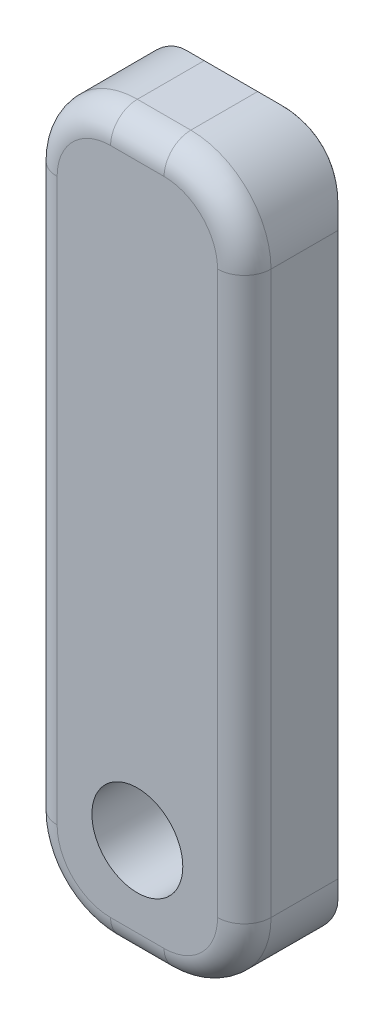
ISO-10303-21;
HEADER;
FILE_DESCRIPTION(('STEP AP214'),'2;1');
FILE_NAME('part.step','',(''),(''),'','','');
FILE_SCHEMA(('AUTOMOTIVE_DESIGN { 1 0 10303 214 1 1 1 1 }'));
ENDSEC;
DATA;
#1=APPLICATION_CONTEXT('core data for automotive mechanical design processes');
#2=APPLICATION_PROTOCOL_DEFINITION('international standard','automotive_design',2000,#1);
#3=PRODUCT_CONTEXT('',#1,'mechanical');
#4=PRODUCT('Part','Part','',(#3));
#5=PRODUCT_RELATED_PRODUCT_CATEGORY('part','',(#4));
#6=PRODUCT_DEFINITION_FORMATION('','',#4);
#7=PRODUCT_DEFINITION_CONTEXT('part definition',#1,'design');
#8=PRODUCT_DEFINITION('design','',#6,#7);
#9=PRODUCT_DEFINITION_SHAPE('','',#8);
#10=(LENGTH_UNIT() NAMED_UNIT(*) SI_UNIT(.MILLI.,.METRE.));
#11=(NAMED_UNIT(*) PLANE_ANGLE_UNIT() SI_UNIT($,.RADIAN.));
#12=(NAMED_UNIT(*) SI_UNIT($,.STERADIAN.) SOLID_ANGLE_UNIT());
#13=UNCERTAINTY_MEASURE_WITH_UNIT(LENGTH_MEASURE(1.E-05),#10,'distance_accuracy_value','');
#14=(GEOMETRIC_REPRESENTATION_CONTEXT(3) GLOBAL_UNCERTAINTY_ASSIGNED_CONTEXT((#13)) GLOBAL_UNIT_ASSIGNED_CONTEXT((#10,
#11,#12)) REPRESENTATION_CONTEXT('',''));
#15=CARTESIAN_POINT('',(0.,0.,0.));
#16=DIRECTION('',(0.,0.,1.));
#17=DIRECTION('',(1.,0.,0.));
#18=AXIS2_PLACEMENT_3D('',#15,#16,#17);
#19=CARTESIAN_POINT('',(0.,0.,5.));
#20=DIRECTION('',(0.,0.,1.));
#21=DIRECTION('',(1.,0.,0.));
#22=AXIS2_PLACEMENT_3D('',#19,#20,#21);
#23=PLANE('',#22);
#24=CARTESIAN_POINT('',(0.,-9.49999999999999,5.));
#25=DIRECTION('',(0.,0.,1.));
#26=DIRECTION('',(1.,0.,0.));
#27=AXIS2_PLACEMENT_3D('',#24,#25,#26);
#28=CIRCLE('',#27,1.7);
#29=CARTESIAN_POINT('',(1.7,-9.49999999999999,5.));
#30=VERTEX_POINT('',#29);
#31=EDGE_CURVE('E479',#30,#30,#28,.T.);
#32=ORIENTED_EDGE('',*,*,#31,.F.);
#33=EDGE_LOOP('',(#32));
#34=FACE_BOUND('',#33,.T.);
#35=CARTESIAN_POINT('',(-0.999999999999996,10.5,5.));
#36=DIRECTION('',(0.,0.,1.));
#37=DIRECTION('',(1.,0.,0.));
#38=AXIS2_PLACEMENT_3D('',#35,#36,#37);
#39=CIRCLE('',#38,2.);
#40=CARTESIAN_POINT('',(-3.,10.5,5.));
#41=VERTEX_POINT('',#40);
#42=CARTESIAN_POINT('',(-0.999999999999996,12.5,5.));
#43=VERTEX_POINT('',#42);
#44=EDGE_CURVE('E207',#41,#43,#39,.F.);
#45=ORIENTED_EDGE('',*,*,#44,.F.);
#46=DIRECTION('',(0.,-1.,0.));
#47=VECTOR('',#46,1.);
#48=CARTESIAN_POINT('',(-3.,-13.5,5.));
#49=LINE('',#48,#47);
#50=CARTESIAN_POINT('',(-3.,-10.5,5.));
#51=VERTEX_POINT('',#50);
#52=EDGE_CURVE('E337',#41,#51,#49,.T.);
#53=ORIENTED_EDGE('',*,*,#52,.T.);
#54=CARTESIAN_POINT('',(-0.999999999999999,-10.5,5.));
#55=DIRECTION('',(0.,0.,1.));
#56=DIRECTION('',(1.,0.,0.));
#57=AXIS2_PLACEMENT_3D('',#54,#55,#56);
#58=CIRCLE('',#57,2.);
#59=CARTESIAN_POINT('',(-0.999999999999998,-12.5,5.));
#60=VERTEX_POINT('',#59);
#61=EDGE_CURVE('E217',#60,#51,#58,.F.);
#62=ORIENTED_EDGE('',*,*,#61,.F.);
#63=DIRECTION('',(1.,0.,0.));
#64=VECTOR('',#63,1.);
#65=CARTESIAN_POINT('',(4.,-12.5,5.));
#66=LINE('',#65,#64);
#67=CARTESIAN_POINT('',(1.,-12.5,5.));
#68=VERTEX_POINT('',#67);
#69=EDGE_CURVE('E343',#60,#68,#66,.T.);
#70=ORIENTED_EDGE('',*,*,#69,.T.);
#71=CARTESIAN_POINT('',(1.,-10.5,5.));
#72=DIRECTION('',(0.,0.,1.));
#73=DIRECTION('',(1.,0.,0.));
#74=AXIS2_PLACEMENT_3D('',#71,#72,#73);
#75=CIRCLE('',#74,2.);
#76=CARTESIAN_POINT('',(3.,-10.5,5.));
#77=VERTEX_POINT('',#76);
#78=EDGE_CURVE('E211',#77,#68,#75,.F.);
#79=ORIENTED_EDGE('',*,*,#78,.F.);
#80=DIRECTION('',(0.,1.,0.));
#81=VECTOR('',#80,1.);
#82=CARTESIAN_POINT('',(3.,13.5,5.));
#83=LINE('',#82,#81);
#84=CARTESIAN_POINT('',(3.,10.5,5.));
#85=VERTEX_POINT('',#84);
#86=EDGE_CURVE('E340',#77,#85,#83,.T.);
#87=ORIENTED_EDGE('',*,*,#86,.T.);
#88=CARTESIAN_POINT('',(0.999999999999999,10.5,5.));
#89=DIRECTION('',(0.,0.,1.));
#90=DIRECTION('',(1.,0.,0.));
#91=AXIS2_PLACEMENT_3D('',#88,#89,#90);
#92=CIRCLE('',#91,2.);
#93=CARTESIAN_POINT('',(0.999999999999999,12.5,5.));
#94=VERTEX_POINT('',#93);
#95=EDGE_CURVE('E208',#94,#85,#92,.F.);
#96=ORIENTED_EDGE('',*,*,#95,.F.);
#97=DIRECTION('',(-1.,0.,0.));
#98=VECTOR('',#97,1.);
#99=CARTESIAN_POINT('',(-4.,12.5,5.));
#100=LINE('',#99,#98);
#101=EDGE_CURVE('E335',#94,#43,#100,.T.);
#102=ORIENTED_EDGE('',*,*,#101,.T.);
#103=EDGE_LOOP('',(#45,#53,#62,#70,#79,#87,#96,#102));
#104=FACE_BOUND('',#103,.T.);
#105=ADVANCED_FACE('F34',(#34,#104),#23,.T.);
#106=CARTESIAN_POINT('',(0.,0.,0.));
#107=DIRECTION('',(0.,0.,1.));
#108=DIRECTION('',(1.,0.,0.));
#109=AXIS2_PLACEMENT_3D('',#106,#107,#108);
#110=PLANE('',#109);
#111=DIRECTION('',(0.,-1.,0.));
#112=VECTOR('',#111,1.);
#113=CARTESIAN_POINT('',(2.49999999999999,0.,0.));
#114=LINE('',#113,#112);
#115=CARTESIAN_POINT('',(2.49999999999999,9.87867965644034,0.));
#116=VERTEX_POINT('',#115);
#117=CARTESIAN_POINT('',(2.49999999999999,-9.87867965644035,0.));
#118=VERTEX_POINT('',#117);
#119=EDGE_CURVE('E318',#116,#118,#114,.T.);
#120=ORIENTED_EDGE('',*,*,#119,.T.);
#121=CARTESIAN_POINT('',(-1.74264068711931,-7.75735931288069,0.));
#122=DIRECTION('',(0.,0.,1.));
#123=DIRECTION('',(0.707106781186548,-0.707106781186547,0.));
#124=AXIS2_PLACEMENT_3D('',#121,#122,#123);
#125=ELLIPSE('',#124,5.19615242270665,3.);
#126=CARTESIAN_POINT('',(0.37867965644035,-12.,0.));
#127=VERTEX_POINT('',#126);
#128=EDGE_CURVE('E255',#118,#127,#125,.F.);
#129=ORIENTED_EDGE('',*,*,#128,.T.);
#130=DIRECTION('',(-1.,0.,0.));
#131=VECTOR('',#130,1.);
#132=CARTESIAN_POINT('',(0.,-12.,0.));
#133=LINE('',#132,#131);
#134=CARTESIAN_POINT('',(-0.378679656440348,-12.,0.));
#135=VERTEX_POINT('',#134);
#136=EDGE_CURVE('E320',#127,#135,#133,.T.);
#137=ORIENTED_EDGE('',*,*,#136,.T.);
#138=CARTESIAN_POINT('',(1.74264068711931,-7.75735931288069,0.));
#139=DIRECTION('',(0.,0.,1.));
#140=DIRECTION('',(0.707106781186548,0.707106781186547,0.));
#141=AXIS2_PLACEMENT_3D('',#138,#139,#140);
#142=ELLIPSE('',#141,5.19615242270665,3.);
#143=CARTESIAN_POINT('',(-2.49999999999999,-9.87867965644034,0.));
#144=VERTEX_POINT('',#143);
#145=EDGE_CURVE('E253',#135,#144,#142,.F.);
#146=ORIENTED_EDGE('',*,*,#145,.T.);
#147=DIRECTION('',(0.,1.,0.));
#148=VECTOR('',#147,1.);
#149=CARTESIAN_POINT('',(-2.49999999999999,0.,0.));
#150=LINE('',#149,#148);
#151=CARTESIAN_POINT('',(-2.49999999999998,9.87867965644034,0.));
#152=VERTEX_POINT('',#151);
#153=EDGE_CURVE('E317',#144,#152,#150,.T.);
#154=ORIENTED_EDGE('',*,*,#153,.T.);
#155=CARTESIAN_POINT('',(1.74264068711931,7.75735931288068,0.));
#156=DIRECTION('',(0.,0.,1.));
#157=DIRECTION('',(0.707106781186547,-0.707106781186548,0.));
#158=AXIS2_PLACEMENT_3D('',#155,#156,#157);
#159=ELLIPSE('',#158,5.19615242270665,3.);
#160=CARTESIAN_POINT('',(-0.378679656440345,12.,0.));
#161=VERTEX_POINT('',#160);
#162=EDGE_CURVE('E251',#152,#161,#159,.F.);
#163=ORIENTED_EDGE('',*,*,#162,.T.);
#164=DIRECTION('',(1.,0.,0.));
#165=VECTOR('',#164,1.);
#166=CARTESIAN_POINT('',(0.,12.,0.));
#167=LINE('',#166,#165);
#168=CARTESIAN_POINT('',(0.378679656440351,12.,0.));
#169=VERTEX_POINT('',#168);
#170=EDGE_CURVE('E309',#161,#169,#167,.T.);
#171=ORIENTED_EDGE('',*,*,#170,.T.);
#172=CARTESIAN_POINT('',(-1.74264068711931,7.75735931288068,0.));
#173=DIRECTION('',(0.,0.,1.));
#174=DIRECTION('',(0.707106781186548,0.707106781186547,0.));
#175=AXIS2_PLACEMENT_3D('',#172,#173,#174);
#176=ELLIPSE('',#175,5.19615242270665,3.);
#177=EDGE_CURVE('E249',#169,#116,#176,.F.);
#178=ORIENTED_EDGE('',*,*,#177,.T.);
#179=EDGE_LOOP('',(#120,#129,#137,#146,#154,#163,#171,#178));
#180=FACE_BOUND('',#179,.T.);
#181=CARTESIAN_POINT('',(0.,-9.49999999999999,0.));
#182=DIRECTION('',(0.,0.,1.));
#183=DIRECTION('',(1.,0.,0.));
#184=AXIS2_PLACEMENT_3D('',#181,#182,#183);
#185=CIRCLE('',#184,1.7);
#186=CARTESIAN_POINT('',(1.7,-9.49999999999999,0.));
#187=VERTEX_POINT('',#186);
#188=EDGE_CURVE('E282',#187,#187,#185,.T.);
#189=ORIENTED_EDGE('',*,*,#188,.T.);
#190=EDGE_LOOP('',(#189));
#191=FACE_BOUND('',#190,.T.);
#192=ADVANCED_FACE('F312',(#180,#191),#110,.F.);
#193=CARTESIAN_POINT('',(4.,13.5,5.));
#194=DIRECTION('',(-1.,0.,0.));
#195=DIRECTION('',(0.,-1.,0.));
#196=AXIS2_PLACEMENT_3D('',#193,#194,#195);
#197=PLANE('',#196);
#198=DIRECTION('',(0.,1.,0.));
#199=VECTOR('',#198,1.);
#200=CARTESIAN_POINT('',(4.,13.5,1.5));
#201=LINE('',#200,#199);
#202=CARTESIAN_POINT('',(4.,-10.5,1.5));
#203=VERTEX_POINT('',#202);
#204=CARTESIAN_POINT('',(4.,10.5,1.5));
#205=VERTEX_POINT('',#204);
#206=EDGE_CURVE('E332',#203,#205,#201,.T.);
#207=ORIENTED_EDGE('',*,*,#206,.T.);
#208=DIRECTION('',(0.,0.,-1.));
#209=VECTOR('',#208,1.);
#210=CARTESIAN_POINT('',(4.,10.5,5.));
#211=LINE('',#210,#209);
#212=CARTESIAN_POINT('',(4.,10.5,4.));
#213=VERTEX_POINT('',#212);
#214=EDGE_CURVE('E273',#205,#213,#211,.F.);
#215=ORIENTED_EDGE('',*,*,#214,.T.);
#216=DIRECTION('',(0.,1.,0.));
#217=VECTOR('',#216,1.);
#218=CARTESIAN_POINT('',(4.,-13.5,4.));
#219=LINE('',#218,#217);
#220=CARTESIAN_POINT('',(4.,-10.5,4.));
#221=VERTEX_POINT('',#220);
#222=EDGE_CURVE('E349',#213,#221,#219,.F.);
#223=ORIENTED_EDGE('',*,*,#222,.T.);
#224=DIRECTION('',(0.,0.,-1.));
#225=VECTOR('',#224,1.);
#226=CARTESIAN_POINT('',(4.,-10.5,5.));
#227=LINE('',#226,#225);
#228=EDGE_CURVE('E271',#221,#203,#227,.T.);
#229=ORIENTED_EDGE('',*,*,#228,.T.);
#230=EDGE_LOOP('',(#207,#215,#223,#229));
#231=FACE_BOUND('',#230,.T.);
#232=ADVANCED_FACE('F399',(#231),#197,.F.);
#233=CARTESIAN_POINT('',(-4.,13.5,5.));
#234=DIRECTION('',(0.,-1.,0.));
#235=DIRECTION('',(0.,0.,-1.));
#236=AXIS2_PLACEMENT_3D('',#233,#234,#235);
#237=PLANE('',#236);
#238=DIRECTION('',(-1.,0.,0.));
#239=VECTOR('',#238,1.);
#240=CARTESIAN_POINT('',(4.,13.5,4.));
#241=LINE('',#240,#239);
#242=CARTESIAN_POINT('',(-0.999999999999997,13.5,4.));
#243=VERTEX_POINT('',#242);
#244=CARTESIAN_POINT('',(0.999999999999999,13.5,4.));
#245=VERTEX_POINT('',#244);
#246=EDGE_CURVE('E177',#243,#245,#241,.F.);
#247=ORIENTED_EDGE('',*,*,#246,.T.);
#248=DIRECTION('',(0.,0.,-1.));
#249=VECTOR('',#248,1.);
#250=CARTESIAN_POINT('',(0.999999999999999,13.5,5.));
#251=LINE('',#250,#249);
#252=CARTESIAN_POINT('',(0.999999999999999,13.5,1.5));
#253=VERTEX_POINT('',#252);
#254=EDGE_CURVE('E183',#245,#253,#251,.T.);
#255=ORIENTED_EDGE('',*,*,#254,.T.);
#256=DIRECTION('',(-1.,0.,0.));
#257=VECTOR('',#256,1.);
#258=CARTESIAN_POINT('',(-4.,13.5,1.5));
#259=LINE('',#258,#257);
#260=CARTESIAN_POINT('',(-0.999999999999996,13.5,1.5));
#261=VERTEX_POINT('',#260);
#262=EDGE_CURVE('E179',#253,#261,#259,.T.);
#263=ORIENTED_EDGE('',*,*,#262,.T.);
#264=DIRECTION('',(0.,0.,-1.));
#265=VECTOR('',#264,1.);
#266=CARTESIAN_POINT('',(-0.999999999999996,13.5,5.));
#267=LINE('',#266,#265);
#268=EDGE_CURVE('E174',#261,#243,#267,.F.);
#269=ORIENTED_EDGE('',*,*,#268,.T.);
#270=EDGE_LOOP('',(#247,#255,#263,#269));
#271=FACE_BOUND('',#270,.T.);
#272=ADVANCED_FACE('F176',(#271),#237,.F.);
#273=CARTESIAN_POINT('',(-4.,13.5,5.));
#274=DIRECTION('',(1.,0.,0.));
#275=DIRECTION('',(0.,1.,0.));
#276=AXIS2_PLACEMENT_3D('',#273,#274,#275);
#277=PLANE('',#276);
#278=DIRECTION('',(0.,-1.,0.));
#279=VECTOR('',#278,1.);
#280=CARTESIAN_POINT('',(-4.,13.5,1.5));
#281=LINE('',#280,#279);
#282=CARTESIAN_POINT('',(-4.,10.5,1.5));
#283=VERTEX_POINT('',#282);
#284=CARTESIAN_POINT('',(-4.,-10.5,1.5));
#285=VERTEX_POINT('',#284);
#286=EDGE_CURVE('E328',#283,#285,#281,.T.);
#287=ORIENTED_EDGE('',*,*,#286,.T.);
#288=DIRECTION('',(0.,0.,-1.));
#289=VECTOR('',#288,1.);
#290=CARTESIAN_POINT('',(-4.,-10.5,5.));
#291=LINE('',#290,#289);
#292=CARTESIAN_POINT('',(-4.,-10.5,4.));
#293=VERTEX_POINT('',#292);
#294=EDGE_CURVE('E11',#285,#293,#291,.F.);
#295=ORIENTED_EDGE('',*,*,#294,.T.);
#296=DIRECTION('',(0.,-1.,0.));
#297=VECTOR('',#296,1.);
#298=CARTESIAN_POINT('',(-4.,13.5,4.));
#299=LINE('',#298,#297);
#300=CARTESIAN_POINT('',(-4.,10.5,4.));
#301=VERTEX_POINT('',#300);
#302=EDGE_CURVE('E194',#293,#301,#299,.F.);
#303=ORIENTED_EDGE('',*,*,#302,.T.);
#304=DIRECTION('',(0.,0.,-1.));
#305=VECTOR('',#304,1.);
#306=CARTESIAN_POINT('',(-4.,10.5,5.));
#307=LINE('',#306,#305);
#308=EDGE_CURVE('E43',#301,#283,#307,.T.);
#309=ORIENTED_EDGE('',*,*,#308,.T.);
#310=EDGE_LOOP('',(#287,#295,#303,#309));
#311=FACE_BOUND('',#310,.T.);
#312=ADVANCED_FACE('F355',(#311),#277,.F.);
#313=CARTESIAN_POINT('',(-4.,-13.5,5.));
#314=DIRECTION('',(0.,1.,0.));
#315=DIRECTION('',(-1.,0.,0.));
#316=AXIS2_PLACEMENT_3D('',#313,#314,#315);
#317=PLANE('',#316);
#318=DIRECTION('',(1.,0.,0.));
#319=VECTOR('',#318,1.);
#320=CARTESIAN_POINT('',(-4.,-13.5,1.5));
#321=LINE('',#320,#319);
#322=CARTESIAN_POINT('',(-0.999999999999998,-13.5,1.5));
#323=VERTEX_POINT('',#322);
#324=CARTESIAN_POINT('',(1.,-13.5,1.5));
#325=VERTEX_POINT('',#324);
#326=EDGE_CURVE('E322',#323,#325,#321,.T.);
#327=ORIENTED_EDGE('',*,*,#326,.T.);
#328=DIRECTION('',(0.,0.,-1.));
#329=VECTOR('',#328,1.);
#330=CARTESIAN_POINT('',(1.,-13.5,5.));
#331=LINE('',#330,#329);
#332=CARTESIAN_POINT('',(1.,-13.5,4.));
#333=VERTEX_POINT('',#332);
#334=EDGE_CURVE('E277',#325,#333,#331,.F.);
#335=ORIENTED_EDGE('',*,*,#334,.T.);
#336=DIRECTION('',(1.,0.,0.));
#337=VECTOR('',#336,1.);
#338=CARTESIAN_POINT('',(-4.,-13.5,4.));
#339=LINE('',#338,#337);
#340=CARTESIAN_POINT('',(-0.999999999999998,-13.5,4.));
#341=VERTEX_POINT('',#340);
#342=EDGE_CURVE('E346',#333,#341,#339,.F.);
#343=ORIENTED_EDGE('',*,*,#342,.T.);
#344=DIRECTION('',(0.,0.,-1.));
#345=VECTOR('',#344,1.);
#346=CARTESIAN_POINT('',(-0.999999999999998,-13.5,5.));
#347=LINE('',#346,#345);
#348=EDGE_CURVE('E275',#341,#323,#347,.T.);
#349=ORIENTED_EDGE('',*,*,#348,.T.);
#350=EDGE_LOOP('',(#327,#335,#343,#349));
#351=FACE_BOUND('',#350,.T.);
#352=ADVANCED_FACE('F405',(#351),#317,.F.);
#353=CARTESIAN_POINT('',(0.,-9.49999999999999,5.));
#354=DIRECTION('',(0.,0.,-1.));
#355=DIRECTION('',(-1.,0.,0.));
#356=AXIS2_PLACEMENT_3D('',#353,#354,#355);
#357=CYLINDRICAL_SURFACE('',#356,1.7);
#358=ORIENTED_EDGE('',*,*,#31,.T.);
#359=EDGE_LOOP('',(#358));
#360=FACE_BOUND('',#359,.T.);
#361=ORIENTED_EDGE('',*,*,#188,.F.);
#362=EDGE_LOOP('',(#361));
#363=FACE_BOUND('',#362,.T.);
#364=ADVANCED_FACE('F403',(#360,#363),#357,.F.);
#365=CARTESIAN_POINT('',(-4.,13.5,1.5));
#366=DIRECTION('',(0.,-0.707106781186546,0.707106781186549));
#367=DIRECTION('',(-1.,0.,0.));
#368=AXIS2_PLACEMENT_3D('',#365,#366,#367);
#369=PLANE('',#368);
#370=CARTESIAN_POINT('',(0.999999999999999,10.5,-1.49999999999998));
#371=DIRECTION('',(0.,-0.707106781186546,0.707106781186549));
#372=DIRECTION('',(0.,-0.707106781186549,-0.707106781186546));
#373=AXIS2_PLACEMENT_3D('',#370,#371,#372);
#374=ELLIPSE('',#373,4.24264068711928,3.);
#375=CARTESIAN_POINT('',(1.77645713530757,13.3977774788672,1.39777747886721));
#376=VERTEX_POINT('',#375);
#377=EDGE_CURVE('E51',#253,#376,#374,.F.);
#378=ORIENTED_EDGE('',*,*,#377,.T.);
#379=DIRECTION('',(-0.577350269189627,-0.577350269189627,-0.577350269189624));
#380=VECTOR('',#379,1.);
#381=CARTESIAN_POINT('',(-0.0808802290397622,11.5404401145199,-0.459559885480112));
#382=LINE('',#381,#380);
#383=EDGE_CURVE('E184',#376,#169,#382,.T.);
#384=ORIENTED_EDGE('',*,*,#383,.T.);
#385=ORIENTED_EDGE('',*,*,#170,.F.);
#386=DIRECTION('',(-0.577350269189627,0.577350269189627,0.577350269189624));
#387=VECTOR('',#386,1.);
#388=CARTESIAN_POINT('',(-2.58578643762691,14.2071067811865,2.20710678118655));
#389=LINE('',#388,#387);
#390=CARTESIAN_POINT('',(-1.77645713530756,13.3977774788672,1.39777747886721));
#391=VERTEX_POINT('',#390);
#392=EDGE_CURVE('E58',#161,#391,#389,.T.);
#393=ORIENTED_EDGE('',*,*,#392,.T.);
#394=CARTESIAN_POINT('',(-0.999999999999996,10.5,-1.49999999999998));
#395=DIRECTION('',(0.,-0.707106781186546,0.707106781186549));
#396=DIRECTION('',(0.,-0.707106781186549,-0.707106781186546));
#397=AXIS2_PLACEMENT_3D('',#394,#395,#396);
#398=ELLIPSE('',#397,4.24264068711928,3.);
#399=EDGE_CURVE('E265',#391,#261,#398,.F.);
#400=ORIENTED_EDGE('',*,*,#399,.T.);
#401=ORIENTED_EDGE('',*,*,#262,.F.);
#402=EDGE_LOOP('',(#378,#384,#385,#393,#400,#401));
#403=FACE_BOUND('',#402,.T.);
#404=ADVANCED_FACE('F308',(#403),#369,.F.);
#405=CARTESIAN_POINT('',(-4.,13.5,1.5));
#406=DIRECTION('',(0.707106781186546,0.,0.707106781186549));
#407=DIRECTION('',(0.,-1.,0.));
#408=AXIS2_PLACEMENT_3D('',#405,#406,#407);
#409=PLANE('',#408);
#410=ORIENTED_EDGE('',*,*,#153,.F.);
#411=DIRECTION('',(-0.577350269189627,-0.577350269189626,0.577350269189624));
#412=VECTOR('',#411,1.);
#413=CARTESIAN_POINT('',(4.29289321881347,-3.08578643762689,-6.79289321881343));
#414=LINE('',#413,#412);
#415=CARTESIAN_POINT('',(-3.8977774788672,-11.2764571353076,1.39777747886721));
#416=VERTEX_POINT('',#415);
#417=EDGE_CURVE('E263',#144,#416,#414,.T.);
#418=ORIENTED_EDGE('',*,*,#417,.T.);
#419=CARTESIAN_POINT('',(-0.999999999999999,-10.5,-1.49999999999998));
#420=DIRECTION('',(0.707106781186546,0.,0.707106781186549));
#421=DIRECTION('',(0.707106781186549,0.,-0.707106781186546));
#422=AXIS2_PLACEMENT_3D('',#419,#420,#421);
#423=ELLIPSE('',#422,4.24264068711928,3.);
#424=EDGE_CURVE('E261',#416,#285,#423,.F.);
#425=ORIENTED_EDGE('',*,*,#424,.T.);
#426=ORIENTED_EDGE('',*,*,#286,.F.);
#427=CARTESIAN_POINT('',(-0.999999999999996,10.5,-1.49999999999998));
#428=DIRECTION('',(0.707106781186546,0.,0.707106781186549));
#429=DIRECTION('',(0.707106781186549,0.,-0.707106781186546));
#430=AXIS2_PLACEMENT_3D('',#427,#428,#429);
#431=ELLIPSE('',#430,4.24264068711928,3.);
#432=CARTESIAN_POINT('',(-3.8977774788672,11.2764571353076,1.39777747886721));
#433=VERTEX_POINT('',#432);
#434=EDGE_CURVE('E257',#283,#433,#431,.F.);
#435=ORIENTED_EDGE('',*,*,#434,.T.);
#436=DIRECTION('',(-0.577350269189627,0.577350269189627,0.577350269189624));
#437=VECTOR('',#436,1.);
#438=CARTESIAN_POINT('',(-4.70710678118654,12.0857864376269,2.20710678118655));
#439=LINE('',#438,#437);
#440=EDGE_CURVE('E259',#433,#152,#439,.F.);
#441=ORIENTED_EDGE('',*,*,#440,.T.);
#442=EDGE_LOOP('',(#410,#418,#425,#426,#435,#441));
#443=FACE_BOUND('',#442,.T.);
#444=ADVANCED_FACE('F423',(#443),#409,.F.);
#445=CARTESIAN_POINT('',(4.,13.5,1.5));
#446=DIRECTION('',(-0.707106781186546,0.,0.707106781186549));
#447=DIRECTION('',(0.,1.,0.));
#448=AXIS2_PLACEMENT_3D('',#445,#446,#447);
#449=PLANE('',#448);
#450=ORIENTED_EDGE('',*,*,#119,.F.);
#451=DIRECTION('',(-0.577350269189627,-0.577350269189627,-0.577350269189624));
#452=VECTOR('',#451,1.);
#453=CARTESIAN_POINT('',(4.70710678118655,12.0857864376269,2.20710678118655));
#454=LINE('',#453,#452);
#455=CARTESIAN_POINT('',(3.8977774788672,11.2764571353076,1.39777747886721));
#456=VERTEX_POINT('',#455);
#457=EDGE_CURVE('E247',#116,#456,#454,.F.);
#458=ORIENTED_EDGE('',*,*,#457,.T.);
#459=CARTESIAN_POINT('',(0.999999999999999,10.5,-1.49999999999998));
#460=DIRECTION('',(-0.707106781186546,0.,0.707106781186549));
#461=DIRECTION('',(-0.707106781186549,0.,-0.707106781186546));
#462=AXIS2_PLACEMENT_3D('',#459,#460,#461);
#463=ELLIPSE('',#462,4.24264068711928,3.);
#464=EDGE_CURVE('E245',#456,#205,#463,.F.);
#465=ORIENTED_EDGE('',*,*,#464,.T.);
#466=ORIENTED_EDGE('',*,*,#206,.F.);
#467=CARTESIAN_POINT('',(1.,-10.5,-1.49999999999998));
#468=DIRECTION('',(-0.707106781186546,0.,0.707106781186549));
#469=DIRECTION('',(-0.707106781186549,0.,-0.707106781186546));
#470=AXIS2_PLACEMENT_3D('',#467,#468,#469);
#471=ELLIPSE('',#470,4.24264068711928,3.);
#472=CARTESIAN_POINT('',(3.8977774788672,-11.2764571353076,1.39777747886721));
#473=VERTEX_POINT('',#472);
#474=EDGE_CURVE('E241',#203,#473,#471,.F.);
#475=ORIENTED_EDGE('',*,*,#474,.T.);
#476=DIRECTION('',(-0.577350269189627,0.577350269189626,-0.577350269189624));
#477=VECTOR('',#476,1.);
#478=CARTESIAN_POINT('',(-4.29289321881347,-3.08578643762689,-6.79289321881343));
#479=LINE('',#478,#477);
#480=EDGE_CURVE('E243',#473,#118,#479,.T.);
#481=ORIENTED_EDGE('',*,*,#480,.T.);
#482=EDGE_LOOP('',(#450,#458,#465,#466,#475,#481));
#483=FACE_BOUND('',#482,.T.);
#484=ADVANCED_FACE('F419',(#483),#449,.F.);
#485=CARTESIAN_POINT('',(-4.,-13.5,1.5));
#486=DIRECTION('',(0.,0.707106781186546,0.707106781186549));
#487=DIRECTION('',(1.,0.,0.));
#488=AXIS2_PLACEMENT_3D('',#485,#486,#487);
#489=PLANE('',#488);
#490=ORIENTED_EDGE('',*,*,#136,.F.);
#491=DIRECTION('',(-0.577350269189627,0.577350269189626,-0.577350269189624));
#492=VECTOR('',#491,1.);
#493=CARTESIAN_POINT('',(-0.0808802290397656,-11.5404401145199,-0.459559885480113));
#494=LINE('',#493,#492);
#495=CARTESIAN_POINT('',(1.77645713530757,-13.3977774788672,1.39777747886721));
#496=VERTEX_POINT('',#495);
#497=EDGE_CURVE('E239',#127,#496,#494,.F.);
#498=ORIENTED_EDGE('',*,*,#497,.T.);
#499=CARTESIAN_POINT('',(1.,-10.5,-1.49999999999998));
#500=DIRECTION('',(0.,0.707106781186546,0.707106781186549));
#501=DIRECTION('',(0.,0.707106781186549,-0.707106781186546));
#502=AXIS2_PLACEMENT_3D('',#499,#500,#501);
#503=ELLIPSE('',#502,4.24264068711928,3.);
#504=EDGE_CURVE('E237',#496,#325,#503,.F.);
#505=ORIENTED_EDGE('',*,*,#504,.T.);
#506=ORIENTED_EDGE('',*,*,#326,.F.);
#507=CARTESIAN_POINT('',(-0.999999999999999,-10.5,-1.49999999999998));
#508=DIRECTION('',(0.,0.707106781186546,0.707106781186549));
#509=DIRECTION('',(0.,0.707106781186549,-0.707106781186546));
#510=AXIS2_PLACEMENT_3D('',#507,#508,#509);
#511=ELLIPSE('',#510,4.24264068711928,3.);
#512=CARTESIAN_POINT('',(-1.77645713530757,-13.3977774788672,1.39777747886721));
#513=VERTEX_POINT('',#512);
#514=EDGE_CURVE('E233',#323,#513,#511,.F.);
#515=ORIENTED_EDGE('',*,*,#514,.T.);
#516=DIRECTION('',(-0.577350269189627,-0.577350269189627,0.577350269189624));
#517=VECTOR('',#516,1.);
#518=CARTESIAN_POINT('',(-2.58578643762691,-14.2071067811865,2.20710678118655));
#519=LINE('',#518,#517);
#520=EDGE_CURVE('E235',#513,#135,#519,.F.);
#521=ORIENTED_EDGE('',*,*,#520,.T.);
#522=EDGE_LOOP('',(#490,#498,#505,#506,#515,#521));
#523=FACE_BOUND('',#522,.T.);
#524=ADVANCED_FACE('F416',(#523),#489,.F.);
#525=CARTESIAN_POINT('',(0.,12.5,4.));
#526=DIRECTION('',(1.,0.,0.));
#527=DIRECTION('',(0.,0.,-1.));
#528=AXIS2_PLACEMENT_3D('',#525,#526,#527);
#529=CYLINDRICAL_SURFACE('',#528,1.);
#530=ORIENTED_EDGE('',*,*,#246,.F.);
#531=CARTESIAN_POINT('',(-0.999999999999996,12.5,4.));
#532=DIRECTION('',(1.,0.,0.));
#533=DIRECTION('',(0.,0.,-1.));
#534=AXIS2_PLACEMENT_3D('',#531,#532,#533);
#535=CIRCLE('',#534,1.);
#536=EDGE_CURVE('E191',#243,#43,#535,.T.);
#537=ORIENTED_EDGE('',*,*,#536,.T.);
#538=ORIENTED_EDGE('',*,*,#101,.F.);
#539=CARTESIAN_POINT('',(0.999999999999999,12.5,4.));
#540=DIRECTION('',(-1.,0.,0.));
#541=DIRECTION('',(0.,0.,1.));
#542=AXIS2_PLACEMENT_3D('',#539,#540,#541);
#543=CIRCLE('',#542,1.);
#544=EDGE_CURVE('E193',#94,#245,#543,.T.);
#545=ORIENTED_EDGE('',*,*,#544,.T.);
#546=EDGE_LOOP('',(#530,#537,#538,#545));
#547=FACE_BOUND('',#546,.T.);
#548=ADVANCED_FACE('F188',(#547),#529,.T.);
#549=CARTESIAN_POINT('',(-3.,0.,4.));
#550=DIRECTION('',(0.,1.,0.));
#551=DIRECTION('',(-1.,0.,0.));
#552=AXIS2_PLACEMENT_3D('',#549,#550,#551);
#553=CYLINDRICAL_SURFACE('',#552,1.);
#554=ORIENTED_EDGE('',*,*,#302,.F.);
#555=CARTESIAN_POINT('',(-3.,-10.5,4.));
#556=DIRECTION('',(0.,1.,0.));
#557=DIRECTION('',(0.,0.,1.));
#558=AXIS2_PLACEMENT_3D('',#555,#556,#557);
#559=CIRCLE('',#558,1.);
#560=EDGE_CURVE('E222',#293,#51,#559,.T.);
#561=ORIENTED_EDGE('',*,*,#560,.T.);
#562=ORIENTED_EDGE('',*,*,#52,.F.);
#563=CARTESIAN_POINT('',(-3.,10.5,4.));
#564=DIRECTION('',(0.,-1.,0.));
#565=DIRECTION('',(0.,0.,-1.));
#566=AXIS2_PLACEMENT_3D('',#563,#564,#565);
#567=CIRCLE('',#566,1.);
#568=EDGE_CURVE('E220',#41,#301,#567,.T.);
#569=ORIENTED_EDGE('',*,*,#568,.T.);
#570=EDGE_LOOP('',(#554,#561,#562,#569));
#571=FACE_BOUND('',#570,.T.);
#572=ADVANCED_FACE('F360',(#571),#553,.T.);
#573=CARTESIAN_POINT('',(3.,0.,4.));
#574=DIRECTION('',(0.,-1.,0.));
#575=DIRECTION('',(1.,0.,0.));
#576=AXIS2_PLACEMENT_3D('',#573,#574,#575);
#577=CYLINDRICAL_SURFACE('',#576,1.);
#578=ORIENTED_EDGE('',*,*,#222,.F.);
#579=CARTESIAN_POINT('',(3.,10.5,4.));
#580=DIRECTION('',(0.,-1.,0.));
#581=DIRECTION('',(0.,0.,-1.));
#582=AXIS2_PLACEMENT_3D('',#579,#580,#581);
#583=CIRCLE('',#582,1.);
#584=EDGE_CURVE('E231',#213,#85,#583,.T.);
#585=ORIENTED_EDGE('',*,*,#584,.T.);
#586=ORIENTED_EDGE('',*,*,#86,.F.);
#587=CARTESIAN_POINT('',(3.,-10.5,4.));
#588=DIRECTION('',(0.,1.,0.));
#589=DIRECTION('',(0.,0.,1.));
#590=AXIS2_PLACEMENT_3D('',#587,#588,#589);
#591=CIRCLE('',#590,1.);
#592=EDGE_CURVE('E229',#77,#221,#591,.T.);
#593=ORIENTED_EDGE('',*,*,#592,.T.);
#594=EDGE_LOOP('',(#578,#585,#586,#593));
#595=FACE_BOUND('',#594,.T.);
#596=ADVANCED_FACE('F385',(#595),#577,.T.);
#597=CARTESIAN_POINT('',(0.,-12.5,4.));
#598=DIRECTION('',(-1.,0.,0.));
#599=DIRECTION('',(0.,-1.,0.));
#600=AXIS2_PLACEMENT_3D('',#597,#598,#599);
#601=CYLINDRICAL_SURFACE('',#600,1.);
#602=ORIENTED_EDGE('',*,*,#342,.F.);
#603=CARTESIAN_POINT('',(1.,-12.5,4.));
#604=DIRECTION('',(-1.,0.,0.));
#605=DIRECTION('',(0.,-1.,0.));
#606=AXIS2_PLACEMENT_3D('',#603,#604,#605);
#607=CIRCLE('',#606,1.);
#608=EDGE_CURVE('E227',#333,#68,#607,.T.);
#609=ORIENTED_EDGE('',*,*,#608,.T.);
#610=ORIENTED_EDGE('',*,*,#69,.F.);
#611=CARTESIAN_POINT('',(-0.999999999999998,-12.5,4.));
#612=DIRECTION('',(1.,0.,0.));
#613=DIRECTION('',(0.,1.,0.));
#614=AXIS2_PLACEMENT_3D('',#611,#612,#613);
#615=CIRCLE('',#614,1.);
#616=EDGE_CURVE('E225',#60,#341,#615,.T.);
#617=ORIENTED_EDGE('',*,*,#616,.T.);
#618=EDGE_LOOP('',(#602,#609,#610,#617));
#619=FACE_BOUND('',#618,.T.);
#620=ADVANCED_FACE('F376',(#619),#601,.T.);
#621=CARTESIAN_POINT('',(-2.58578643762691,12.0857864376269,4.3284271247462));
#622=DIRECTION('',(0.577350269189627,-0.577350269189627,-0.577350269189624));
#623=DIRECTION('',(0.707106781186548,0.707106781186547,0.));
#624=AXIS2_PLACEMENT_3D('',#621,#622,#623);
#625=CYLINDRICAL_SURFACE('',#624,3.);
#626=ORIENTED_EDGE('',*,*,#162,.F.);
#627=ORIENTED_EDGE('',*,*,#440,.F.);
#628=CARTESIAN_POINT('',(-0.999999999999996,10.5,2.74264068711929));
#629=DIRECTION('',(0.325057583671869,-0.325057583671869,-0.888073833977115));
#630=DIRECTION('',(-0.627963030199554,0.627963030199554,-0.459700843380984));
#631=AXIS2_PLACEMENT_3D('',#628,#629,#630);
#632=ELLIPSE('',#631,3.37809750183148,3.);
#633=EDGE_CURVE('E203',#391,#433,#632,.F.);
#634=ORIENTED_EDGE('',*,*,#633,.F.);
#635=ORIENTED_EDGE('',*,*,#392,.F.);
#636=EDGE_LOOP('',(#626,#627,#634,#635));
#637=FACE_BOUND('',#636,.T.);
#638=ADVANCED_FACE('F432',(#637),#625,.T.);
#639=CARTESIAN_POINT('',(-0.999999999999996,10.5,5.));
#640=DIRECTION('',(0.,0.,-1.));
#641=DIRECTION('',(-1.,0.,0.));
#642=AXIS2_PLACEMENT_3D('',#639,#640,#641);
#643=CYLINDRICAL_SURFACE('',#642,3.);
#644=ORIENTED_EDGE('',*,*,#434,.F.);
#645=ORIENTED_EDGE('',*,*,#308,.F.);
#646=CARTESIAN_POINT('',(-0.999999999999996,10.5,4.));
#647=DIRECTION('',(0.,0.,1.));
#648=DIRECTION('',(1.,0.,0.));
#649=AXIS2_PLACEMENT_3D('',#646,#647,#648);
#650=CIRCLE('',#649,3.);
#651=EDGE_CURVE('E198',#243,#301,#650,.T.);
#652=ORIENTED_EDGE('',*,*,#651,.F.);
#653=ORIENTED_EDGE('',*,*,#268,.F.);
#654=ORIENTED_EDGE('',*,*,#399,.F.);
#655=ORIENTED_EDGE('',*,*,#633,.T.);
#656=EDGE_LOOP('',(#644,#645,#652,#653,#654,#655));
#657=FACE_BOUND('',#656,.T.);
#658=ADVANCED_FACE('F200',(#657),#643,.T.);
#659=CARTESIAN_POINT('',(-0.999999999999996,10.5,4.));
#660=DIRECTION('',(0.,0.,1.));
#661=DIRECTION('',(1.,0.,0.));
#662=AXIS2_PLACEMENT_3D('',#659,#660,#661);
#663=TOROIDAL_SURFACE('',#662,2.,1.);
#664=ORIENTED_EDGE('',*,*,#536,.F.);
#665=ORIENTED_EDGE('',*,*,#651,.T.);
#666=ORIENTED_EDGE('',*,*,#568,.F.);
#667=ORIENTED_EDGE('',*,*,#44,.T.);
#668=EDGE_LOOP('',(#664,#665,#666,#667));
#669=FACE_BOUND('',#668,.T.);
#670=ADVANCED_FACE('F206',(#669),#663,.T.);
#671=CARTESIAN_POINT('',(-2.58578643762691,-12.0857864376269,4.3284271247462));
#672=DIRECTION('',(0.577350269189627,0.577350269189626,-0.577350269189624));
#673=DIRECTION('',(-0.707106781186547,0.707106781186548,0.));
#674=AXIS2_PLACEMENT_3D('',#671,#672,#673);
#675=CYLINDRICAL_SURFACE('',#674,3.);
#676=ORIENTED_EDGE('',*,*,#145,.F.);
#677=ORIENTED_EDGE('',*,*,#520,.F.);
#678=CARTESIAN_POINT('',(-0.999999999999999,-10.5,2.74264068711929));
#679=DIRECTION('',(0.325057583671869,0.325057583671869,-0.888073833977115));
#680=DIRECTION('',(-0.627963030199554,-0.627963030199554,-0.459700843380984));
#681=AXIS2_PLACEMENT_3D('',#678,#679,#680);
#682=ELLIPSE('',#681,3.37809750183148,3.);
#683=EDGE_CURVE('E204',#416,#513,#682,.F.);
#684=ORIENTED_EDGE('',*,*,#683,.F.);
#685=ORIENTED_EDGE('',*,*,#417,.F.);
#686=EDGE_LOOP('',(#676,#677,#684,#685));
#687=FACE_BOUND('',#686,.T.);
#688=ADVANCED_FACE('F441',(#687),#675,.T.);
#689=CARTESIAN_POINT('',(-0.999999999999999,-10.5,5.));
#690=DIRECTION('',(0.,0.,-1.));
#691=DIRECTION('',(-1.,0.,0.));
#692=AXIS2_PLACEMENT_3D('',#689,#690,#691);
#693=CYLINDRICAL_SURFACE('',#692,3.);
#694=ORIENTED_EDGE('',*,*,#514,.F.);
#695=ORIENTED_EDGE('',*,*,#348,.F.);
#696=CARTESIAN_POINT('',(-0.999999999999999,-10.5,4.));
#697=DIRECTION('',(0.,0.,1.));
#698=DIRECTION('',(1.,0.,0.));
#699=AXIS2_PLACEMENT_3D('',#696,#697,#698);
#700=CIRCLE('',#699,3.);
#701=EDGE_CURVE('E283',#293,#341,#700,.T.);
#702=ORIENTED_EDGE('',*,*,#701,.F.);
#703=ORIENTED_EDGE('',*,*,#294,.F.);
#704=ORIENTED_EDGE('',*,*,#424,.F.);
#705=ORIENTED_EDGE('',*,*,#683,.T.);
#706=EDGE_LOOP('',(#694,#695,#702,#703,#704,#705));
#707=FACE_BOUND('',#706,.T.);
#708=ADVANCED_FACE('F366',(#707),#693,.T.);
#709=CARTESIAN_POINT('',(-0.999999999999999,-10.5,4.));
#710=DIRECTION('',(0.,0.,1.));
#711=DIRECTION('',(1.,0.,0.));
#712=AXIS2_PLACEMENT_3D('',#709,#710,#711);
#713=TOROIDAL_SURFACE('',#712,2.,1.);
#714=ORIENTED_EDGE('',*,*,#560,.F.);
#715=ORIENTED_EDGE('',*,*,#701,.T.);
#716=ORIENTED_EDGE('',*,*,#616,.F.);
#717=ORIENTED_EDGE('',*,*,#61,.T.);
#718=EDGE_LOOP('',(#714,#715,#716,#717));
#719=FACE_BOUND('',#718,.T.);
#720=ADVANCED_FACE('F370',(#719),#713,.T.);
#721=CARTESIAN_POINT('',(-0.0808802290397656,-9.41911977096023,1.66176045807953));
#722=DIRECTION('',(0.577350269189627,-0.577350269189626,0.577350269189624));
#723=DIRECTION('',(0.707106781186547,0.707106781186548,0.));
#724=AXIS2_PLACEMENT_3D('',#721,#722,#723);
#725=CYLINDRICAL_SURFACE('',#724,3.);
#726=ORIENTED_EDGE('',*,*,#128,.F.);
#727=ORIENTED_EDGE('',*,*,#480,.F.);
#728=CARTESIAN_POINT('',(1.,-10.5,2.74264068711929));
#729=DIRECTION('',(-0.325057583671869,0.325057583671869,-0.888073833977115));
#730=DIRECTION('',(0.627963030199554,-0.627963030199554,-0.459700843380984));
#731=AXIS2_PLACEMENT_3D('',#728,#729,#730);
#732=ELLIPSE('',#731,3.37809750183148,3.);
#733=EDGE_CURVE('E286',#496,#473,#732,.F.);
#734=ORIENTED_EDGE('',*,*,#733,.F.);
#735=ORIENTED_EDGE('',*,*,#497,.F.);
#736=EDGE_LOOP('',(#726,#727,#734,#735));
#737=FACE_BOUND('',#736,.T.);
#738=ADVANCED_FACE('F449',(#737),#725,.T.);
#739=CARTESIAN_POINT('',(1.,-10.5,5.));
#740=DIRECTION('',(0.,0.,-1.));
#741=DIRECTION('',(-1.,0.,0.));
#742=AXIS2_PLACEMENT_3D('',#739,#740,#741);
#743=CYLINDRICAL_SURFACE('',#742,3.);
#744=ORIENTED_EDGE('',*,*,#474,.F.);
#745=ORIENTED_EDGE('',*,*,#228,.F.);
#746=CARTESIAN_POINT('',(1.,-10.5,4.));
#747=DIRECTION('',(0.,0.,1.));
#748=DIRECTION('',(1.,0.,0.));
#749=AXIS2_PLACEMENT_3D('',#746,#747,#748);
#750=CIRCLE('',#749,3.);
#751=EDGE_CURVE('E289',#333,#221,#750,.T.);
#752=ORIENTED_EDGE('',*,*,#751,.F.);
#753=ORIENTED_EDGE('',*,*,#334,.F.);
#754=ORIENTED_EDGE('',*,*,#504,.F.);
#755=ORIENTED_EDGE('',*,*,#733,.T.);
#756=EDGE_LOOP('',(#744,#745,#752,#753,#754,#755));
#757=FACE_BOUND('',#756,.T.);
#758=ADVANCED_FACE('F457',(#757),#743,.T.);
#759=CARTESIAN_POINT('',(1.,-10.5,4.));
#760=DIRECTION('',(0.,0.,1.));
#761=DIRECTION('',(1.,0.,0.));
#762=AXIS2_PLACEMENT_3D('',#759,#760,#761);
#763=TOROIDAL_SURFACE('',#762,2.,1.);
#764=ORIENTED_EDGE('',*,*,#592,.F.);
#765=ORIENTED_EDGE('',*,*,#78,.T.);
#766=ORIENTED_EDGE('',*,*,#608,.F.);
#767=ORIENTED_EDGE('',*,*,#751,.T.);
#768=EDGE_LOOP('',(#764,#765,#766,#767));
#769=FACE_BOUND('',#768,.T.);
#770=ADVANCED_FACE('F380',(#769),#763,.T.);
#771=CARTESIAN_POINT('',(2.58578643762691,12.0857864376269,4.3284271247462));
#772=DIRECTION('',(0.577350269189627,0.577350269189627,0.577350269189624));
#773=DIRECTION('',(-0.707106781186547,0.707106781186548,0.));
#774=AXIS2_PLACEMENT_3D('',#771,#772,#773);
#775=CYLINDRICAL_SURFACE('',#774,3.);
#776=ORIENTED_EDGE('',*,*,#177,.F.);
#777=ORIENTED_EDGE('',*,*,#383,.F.);
#778=CARTESIAN_POINT('',(1.,10.5,2.74264068711929));
#779=DIRECTION('',(-0.325057583671869,-0.325057583671869,-0.888073833977115));
#780=DIRECTION('',(0.627963030199554,0.627963030199554,-0.459700843380984));
#781=AXIS2_PLACEMENT_3D('',#778,#779,#780);
#782=ELLIPSE('',#781,3.37809750183148,3.);
#783=EDGE_CURVE('E38',#456,#376,#782,.F.);
#784=ORIENTED_EDGE('',*,*,#783,.F.);
#785=ORIENTED_EDGE('',*,*,#457,.F.);
#786=EDGE_LOOP('',(#776,#777,#784,#785));
#787=FACE_BOUND('',#786,.T.);
#788=ADVANCED_FACE('F36',(#787),#775,.T.);
#789=CARTESIAN_POINT('',(0.999999999999999,10.5,5.));
#790=DIRECTION('',(0.,0.,-1.));
#791=DIRECTION('',(-1.,0.,0.));
#792=AXIS2_PLACEMENT_3D('',#789,#790,#791);
#793=CYLINDRICAL_SURFACE('',#792,3.);
#794=ORIENTED_EDGE('',*,*,#377,.F.);
#795=ORIENTED_EDGE('',*,*,#254,.F.);
#796=CARTESIAN_POINT('',(0.999999999999999,10.5,4.));
#797=DIRECTION('',(0.,0.,1.));
#798=DIRECTION('',(1.,0.,0.));
#799=AXIS2_PLACEMENT_3D('',#796,#797,#798);
#800=CIRCLE('',#799,3.);
#801=EDGE_CURVE('E293',#213,#245,#800,.T.);
#802=ORIENTED_EDGE('',*,*,#801,.F.);
#803=ORIENTED_EDGE('',*,*,#214,.F.);
#804=ORIENTED_EDGE('',*,*,#464,.F.);
#805=ORIENTED_EDGE('',*,*,#783,.T.);
#806=EDGE_LOOP('',(#794,#795,#802,#803,#804,#805));
#807=FACE_BOUND('',#806,.T.);
#808=ADVANCED_FACE('F302',(#807),#793,.T.);
#809=CARTESIAN_POINT('',(0.999999999999999,10.5,4.));
#810=DIRECTION('',(0.,0.,1.));
#811=DIRECTION('',(1.,0.,0.));
#812=AXIS2_PLACEMENT_3D('',#809,#810,#811);
#813=TOROIDAL_SURFACE('',#812,2.,1.);
#814=ORIENTED_EDGE('',*,*,#544,.F.);
#815=ORIENTED_EDGE('',*,*,#95,.T.);
#816=ORIENTED_EDGE('',*,*,#584,.F.);
#817=ORIENTED_EDGE('',*,*,#801,.T.);
#818=EDGE_LOOP('',(#814,#815,#816,#817));
#819=FACE_BOUND('',#818,.T.);
#820=ADVANCED_FACE('F386',(#819),#813,.T.);
#821=CLOSED_SHELL('',(#105,#192,#232,#272,#312,#352,#364,#404,#444,#484,#524,#548,#572,#596,
#620,#638,#658,#670,#688,#708,#720,#738,#758,#770,#788,#808,#820));
#822=MANIFOLD_SOLID_BREP('B2',#821);
#823=ADVANCED_BREP_SHAPE_REPRESENTATION('',(#18,#822),#14);
#824=SHAPE_DEFINITION_REPRESENTATION(#9,#823);
ENDSEC;
END-ISO-10303-21;
